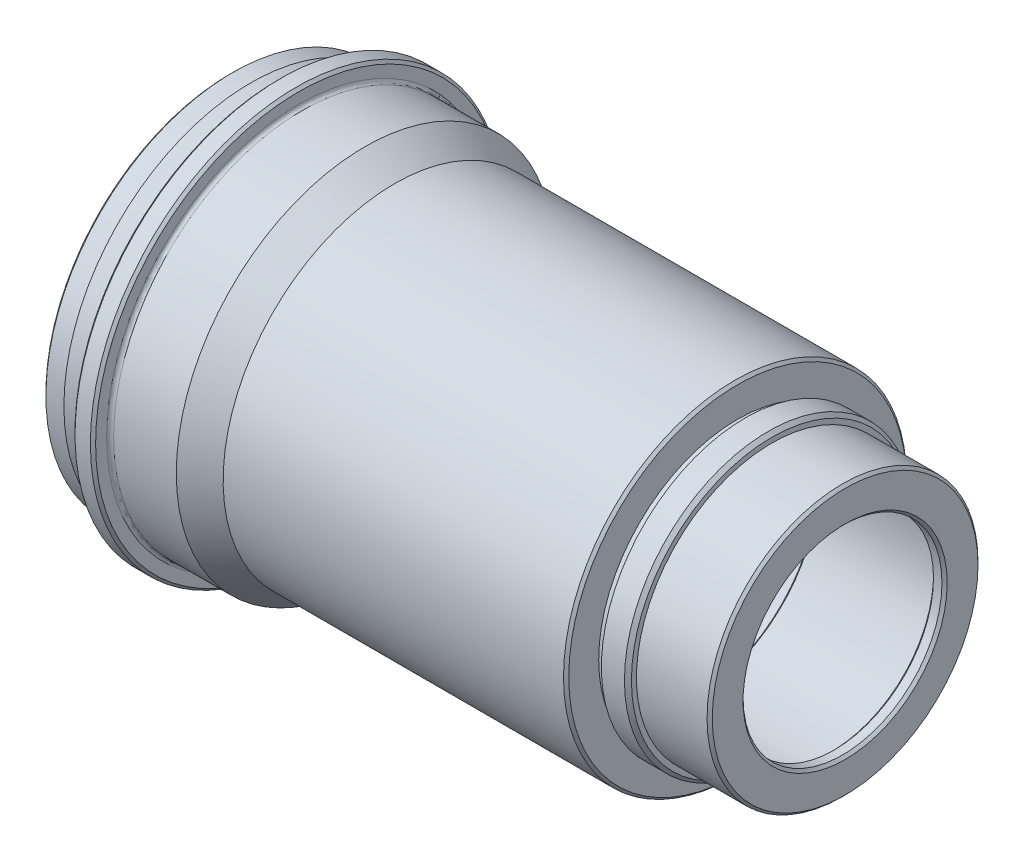
ISO-10303-21;
HEADER;
FILE_DESCRIPTION(('STEP AP214'),'2;1');
FILE_NAME('part.step','',(''),(''),'','','');
FILE_SCHEMA(('AUTOMOTIVE_DESIGN { 1 0 10303 214 1 1 1 1 }'));
ENDSEC;
DATA;
#1=APPLICATION_CONTEXT('core data for automotive mechanical design processes');
#2=APPLICATION_PROTOCOL_DEFINITION('international standard','automotive_design',2000,#1);
#3=PRODUCT_CONTEXT('',#1,'mechanical');
#4=PRODUCT('Part','Part','',(#3));
#5=PRODUCT_RELATED_PRODUCT_CATEGORY('part','',(#4));
#6=PRODUCT_DEFINITION_FORMATION('','',#4);
#7=PRODUCT_DEFINITION_CONTEXT('part definition',#1,'design');
#8=PRODUCT_DEFINITION('design','',#6,#7);
#9=PRODUCT_DEFINITION_SHAPE('','',#8);
#10=(LENGTH_UNIT() NAMED_UNIT(*) SI_UNIT(.MILLI.,.METRE.));
#11=(NAMED_UNIT(*) PLANE_ANGLE_UNIT() SI_UNIT($,.RADIAN.));
#12=(NAMED_UNIT(*) SI_UNIT($,.STERADIAN.) SOLID_ANGLE_UNIT());
#13=UNCERTAINTY_MEASURE_WITH_UNIT(LENGTH_MEASURE(1.E-05),#10,'distance_accuracy_value','');
#14=(GEOMETRIC_REPRESENTATION_CONTEXT(3) GLOBAL_UNCERTAINTY_ASSIGNED_CONTEXT((#13)) GLOBAL_UNIT_ASSIGNED_CONTEXT((#10,
#11,#12)) REPRESENTATION_CONTEXT('',''));
#15=CARTESIAN_POINT('',(0.,0.,0.));
#16=DIRECTION('',(0.,0.,1.));
#17=DIRECTION('',(1.,0.,0.));
#18=AXIS2_PLACEMENT_3D('',#15,#16,#17);
#19=CARTESIAN_POINT('',(72.0904430000001,0.,0.));
#20=DIRECTION('',(-1.,0.,0.));
#21=DIRECTION('',(0.,0.,1.));
#22=AXIS2_PLACEMENT_3D('',#19,#20,#21);
#23=CONICAL_SURFACE('',#22,25.,0.785398163397444);
#24=CARTESIAN_POINT('',(72.0904430000001,0.,0.));
#25=DIRECTION('',(1.,0.,0.));
#26=DIRECTION('',(0.,0.,-1.));
#27=AXIS2_PLACEMENT_3D('',#24,#25,#26);
#28=CIRCLE('',#27,25.);
#29=CARTESIAN_POINT('',(72.0904430000001,0.,-25.));
#30=VERTEX_POINT('',#29);
#31=EDGE_CURVE('E153',#30,#30,#28,.F.);
#32=ORIENTED_EDGE('',*,*,#31,.F.);
#33=EDGE_LOOP('',(#32));
#34=FACE_BOUND('',#33,.T.);
#35=CARTESIAN_POINT('',(72.4714430000001,0.,0.));
#36=DIRECTION('',(-1.,0.,0.));
#37=DIRECTION('',(0.,0.,1.));
#38=AXIS2_PLACEMENT_3D('',#35,#36,#37);
#39=CIRCLE('',#38,24.619);
#40=CARTESIAN_POINT('',(72.4714430000001,0.,24.619));
#41=VERTEX_POINT('',#40);
#42=EDGE_CURVE('E18',#41,#41,#39,.F.);
#43=ORIENTED_EDGE('',*,*,#42,.F.);
#44=EDGE_LOOP('',(#43));
#45=FACE_BOUND('',#44,.T.);
#46=ADVANCED_FACE('F15',(#34,#45),#23,.T.);
#47=CARTESIAN_POINT('',(47.4714430000001,0.,0.));
#48=DIRECTION('',(1.,0.,0.));
#49=DIRECTION('',(0.,0.,-1.));
#50=AXIS2_PLACEMENT_3D('',#47,#48,#49);
#51=CYLINDRICAL_SURFACE('',#50,25.);
#52=CARTESIAN_POINT('',(22.4714430000001,0.,0.));
#53=DIRECTION('',(-1.,0.,0.));
#54=DIRECTION('',(0.,1.,0.));
#55=AXIS2_PLACEMENT_3D('',#52,#53,#54);
#56=CIRCLE('',#55,25.);
#57=CARTESIAN_POINT('',(22.4714430000001,25.,0.));
#58=VERTEX_POINT('',#57);
#59=EDGE_CURVE('E158',#58,#58,#56,.T.);
#60=ORIENTED_EDGE('',*,*,#59,.F.);
#61=EDGE_LOOP('',(#60));
#62=FACE_BOUND('',#61,.T.);
#63=ORIENTED_EDGE('',*,*,#31,.T.);
#64=EDGE_LOOP('',(#63));
#65=FACE_BOUND('',#64,.T.);
#66=ADVANCED_FACE('F219',(#62,#65),#51,.T.);
#67=CARTESIAN_POINT('',(72.4714430000001,20.25,0.));
#68=DIRECTION('',(1.,0.,0.));
#69=DIRECTION('',(0.,0.,-1.));
#70=AXIS2_PLACEMENT_3D('',#67,#68,#69);
#71=PLANE('',#70);
#72=CARTESIAN_POINT('',(72.4714430000001,0.,0.));
#73=DIRECTION('',(1.,0.,0.));
#74=DIRECTION('',(0.,0.,-1.));
#75=AXIS2_PLACEMENT_3D('',#72,#73,#74);
#76=CIRCLE('',#75,20.25);
#77=CARTESIAN_POINT('',(72.4714430000001,0.,-20.25));
#78=VERTEX_POINT('',#77);
#79=EDGE_CURVE('E152',#78,#78,#76,.T.);
#80=ORIENTED_EDGE('',*,*,#79,.F.);
#81=EDGE_LOOP('',(#80));
#82=FACE_BOUND('',#81,.T.);
#83=ORIENTED_EDGE('',*,*,#42,.T.);
#84=EDGE_LOOP('',(#83));
#85=FACE_BOUND('',#84,.T.);
#86=ADVANCED_FACE('F215',(#82,#85),#71,.T.);
#87=CARTESIAN_POINT('',(18.1413159810779,0.,0.));
#88=DIRECTION('',(-1.,0.,0.));
#89=DIRECTION('',(0.,0.,1.));
#90=AXIS2_PLACEMENT_3D('',#87,#88,#89);
#91=CONICAL_SURFACE('',#90,27.5,0.523598775598295);
#92=CARTESIAN_POINT('',(18.1413159810779,0.,0.));
#93=DIRECTION('',(1.,0.,0.));
#94=DIRECTION('',(0.,0.,-1.));
#95=AXIS2_PLACEMENT_3D('',#92,#93,#94);
#96=CIRCLE('',#95,27.5);
#97=CARTESIAN_POINT('',(18.1413159810779,0.,-27.5));
#98=VERTEX_POINT('',#97);
#99=EDGE_CURVE('E144',#98,#98,#96,.F.);
#100=ORIENTED_EDGE('',*,*,#99,.F.);
#101=EDGE_LOOP('',(#100));
#102=FACE_BOUND('',#101,.T.);
#103=ORIENTED_EDGE('',*,*,#59,.T.);
#104=EDGE_LOOP('',(#103));
#105=FACE_BOUND('',#104,.T.);
#106=ADVANCED_FACE('F218',(#102,#105),#91,.T.);
#107=CARTESIAN_POINT('',(73.0339430000001,0.,0.));
#108=DIRECTION('',(1.,0.,0.));
#109=DIRECTION('',(0.,0.,-1.));
#110=AXIS2_PLACEMENT_3D('',#107,#108,#109);
#111=CYLINDRICAL_SURFACE('',#110,20.25);
#112=ORIENTED_EDGE('',*,*,#79,.T.);
#113=EDGE_LOOP('',(#112));
#114=FACE_BOUND('',#113,.T.);
#115=CARTESIAN_POINT('',(73.5964430000001,0.,0.));
#116=DIRECTION('',(1.,0.,0.));
#117=DIRECTION('',(0.,0.,-1.));
#118=AXIS2_PLACEMENT_3D('',#115,#116,#117);
#119=CIRCLE('',#118,20.25);
#120=CARTESIAN_POINT('',(73.5964430000001,0.,-20.25));
#121=VERTEX_POINT('',#120);
#122=EDGE_CURVE('E139',#121,#121,#119,.T.);
#123=ORIENTED_EDGE('',*,*,#122,.F.);
#124=EDGE_LOOP('',(#123));
#125=FACE_BOUND('',#124,.T.);
#126=ADVANCED_FACE('F212',(#114,#125),#111,.T.);
#127=CARTESIAN_POINT('',(13.320657990539,0.,0.));
#128=DIRECTION('',(1.,0.,0.));
#129=DIRECTION('',(0.,0.,-1.));
#130=AXIS2_PLACEMENT_3D('',#127,#128,#129);
#131=CYLINDRICAL_SURFACE('',#130,27.5);
#132=CARTESIAN_POINT('',(9.00799999999998,0.,0.));
#133=DIRECTION('',(1.,0.,0.));
#134=DIRECTION('',(0.,0.,-1.));
#135=AXIS2_PLACEMENT_3D('',#132,#133,#134);
#136=CIRCLE('',#135,27.5);
#137=CARTESIAN_POINT('',(9.00799999999998,0.,-27.5));
#138=VERTEX_POINT('',#137);
#139=EDGE_CURVE('E135',#138,#138,#136,.T.);
#140=ORIENTED_EDGE('',*,*,#139,.T.);
#141=EDGE_LOOP('',(#140));
#142=FACE_BOUND('',#141,.T.);
#143=ORIENTED_EDGE('',*,*,#99,.T.);
#144=EDGE_LOOP('',(#143));
#145=FACE_BOUND('',#144,.T.);
#146=ADVANCED_FACE('F385',(#142,#145),#131,.T.);
#147=CARTESIAN_POINT('',(73.5964430000001,20.989,0.));
#148=DIRECTION('',(-1.,0.,0.));
#149=DIRECTION('',(0.,0.,1.));
#150=AXIS2_PLACEMENT_3D('',#147,#148,#149);
#151=PLANE('',#150);
#152=ORIENTED_EDGE('',*,*,#122,.T.);
#153=EDGE_LOOP('',(#152));
#154=FACE_BOUND('',#153,.T.);
#155=CARTESIAN_POINT('',(73.5964430000001,0.,0.));
#156=DIRECTION('',(1.,0.,0.));
#157=DIRECTION('',(0.,0.,-1.));
#158=AXIS2_PLACEMENT_3D('',#155,#156,#157);
#159=CIRCLE('',#158,20.989);
#160=CARTESIAN_POINT('',(73.5964430000001,0.,-20.989));
#161=VERTEX_POINT('',#160);
#162=EDGE_CURVE('E138',#161,#161,#159,.T.);
#163=ORIENTED_EDGE('',*,*,#162,.F.);
#164=EDGE_LOOP('',(#163));
#165=FACE_BOUND('',#164,.T.);
#166=ADVANCED_FACE('F129',(#154,#165),#151,.T.);
#167=CARTESIAN_POINT('',(9.00799999999998,0.,0.));
#168=DIRECTION('',(1.,0.,0.));
#169=DIRECTION('',(0.,0.,-1.));
#170=AXIS2_PLACEMENT_3D('',#167,#168,#169);
#171=TOROIDAL_SURFACE('',#170,28.008,0.508);
#172=ORIENTED_EDGE('',*,*,#139,.F.);
#173=EDGE_LOOP('',(#172));
#174=FACE_BOUND('',#173,.T.);
#175=CARTESIAN_POINT('',(8.49999999999998,0.,0.));
#176=DIRECTION('',(1.,0.,0.));
#177=DIRECTION('',(0.,0.,1.));
#178=AXIS2_PLACEMENT_3D('',#175,#176,#177);
#179=CIRCLE('',#178,28.008);
#180=CARTESIAN_POINT('',(8.49999999999998,0.,28.008));
#181=VERTEX_POINT('',#180);
#182=EDGE_CURVE('E102',#181,#181,#179,.F.);
#183=ORIENTED_EDGE('',*,*,#182,.F.);
#184=EDGE_LOOP('',(#183));
#185=FACE_BOUND('',#184,.T.);
#186=ADVANCED_FACE('F124',(#174,#185),#171,.F.);
#187=CARTESIAN_POINT('',(75.5339430000001,0.,0.));
#188=DIRECTION('',(1.,0.,0.));
#189=DIRECTION('',(0.,0.,-1.));
#190=AXIS2_PLACEMENT_3D('',#187,#188,#189);
#191=CYLINDRICAL_SURFACE('',#190,20.989);
#192=ORIENTED_EDGE('',*,*,#162,.T.);
#193=EDGE_LOOP('',(#192));
#194=FACE_BOUND('',#193,.T.);
#195=CARTESIAN_POINT('',(76.9634430000002,0.,0.));
#196=DIRECTION('',(-1.,0.,0.));
#197=DIRECTION('',(0.,-1.,0.));
#198=AXIS2_PLACEMENT_3D('',#195,#196,#197);
#199=CIRCLE('',#198,20.989);
#200=CARTESIAN_POINT('',(76.9634430000002,-20.989,0.));
#201=VERTEX_POINT('',#200);
#202=EDGE_CURVE('E107',#201,#201,#199,.F.);
#203=ORIENTED_EDGE('',*,*,#202,.F.);
#204=EDGE_LOOP('',(#203));
#205=FACE_BOUND('',#204,.T.);
#206=ADVANCED_FACE('F120',(#194,#205),#191,.T.);
#207=CARTESIAN_POINT('',(8.49999999999998,27.5,0.));
#208=DIRECTION('',(1.,0.,0.));
#209=DIRECTION('',(0.,0.,-1.));
#210=AXIS2_PLACEMENT_3D('',#207,#208,#209);
#211=PLANE('',#210);
#212=ORIENTED_EDGE('',*,*,#182,.T.);
#213=EDGE_LOOP('',(#212));
#214=FACE_BOUND('',#213,.T.);
#215=CARTESIAN_POINT('',(8.49999999999998,0.,0.));
#216=DIRECTION('',(-1.,0.,0.));
#217=DIRECTION('',(0.,0.,1.));
#218=AXIS2_PLACEMENT_3D('',#215,#216,#217);
#219=CIRCLE('',#218,29.619);
#220=CARTESIAN_POINT('',(8.49999999999998,0.,29.619));
#221=VERTEX_POINT('',#220);
#222=EDGE_CURVE('E203',#221,#221,#219,.T.);
#223=ORIENTED_EDGE('',*,*,#222,.F.);
#224=EDGE_LOOP('',(#223));
#225=FACE_BOUND('',#224,.T.);
#226=ADVANCED_FACE('F109',(#214,#225),#211,.T.);
#227=CARTESIAN_POINT('',(76.9634430000002,0.,0.));
#228=DIRECTION('',(-1.,0.,0.));
#229=DIRECTION('',(0.,0.,1.));
#230=AXIS2_PLACEMENT_3D('',#227,#228,#229);
#231=CONICAL_SURFACE('',#230,20.989,0.785398163397455);
#232=ORIENTED_EDGE('',*,*,#202,.T.);
#233=EDGE_LOOP('',(#232));
#234=FACE_BOUND('',#233,.T.);
#235=CARTESIAN_POINT('',(77.4714430000001,0.,0.));
#236=DIRECTION('',(-1.,0.,0.));
#237=DIRECTION('',(0.,0.,1.));
#238=AXIS2_PLACEMENT_3D('',#235,#236,#237);
#239=CIRCLE('',#238,20.481);
#240=CARTESIAN_POINT('',(77.4714430000001,0.,20.481));
#241=VERTEX_POINT('',#240);
#242=EDGE_CURVE('E93',#241,#241,#239,.F.);
#243=ORIENTED_EDGE('',*,*,#242,.F.);
#244=EDGE_LOOP('',(#243));
#245=FACE_BOUND('',#244,.T.);
#246=ADVANCED_FACE('F119',(#234,#245),#231,.T.);
#247=CARTESIAN_POINT('',(8.11899999999998,0.,0.));
#248=DIRECTION('',(-1.,0.,0.));
#249=DIRECTION('',(0.,0.,1.));
#250=AXIS2_PLACEMENT_3D('',#247,#248,#249);
#251=CONICAL_SURFACE('',#250,30.,0.785398163397435);
#252=CARTESIAN_POINT('',(8.11899999999998,0.,0.));
#253=DIRECTION('',(1.,0.,0.));
#254=DIRECTION('',(0.,0.,-1.));
#255=AXIS2_PLACEMENT_3D('',#252,#253,#254);
#256=CIRCLE('',#255,30.);
#257=CARTESIAN_POINT('',(8.11899999999998,0.,-30.));
#258=VERTEX_POINT('',#257);
#259=EDGE_CURVE('E89',#258,#258,#256,.F.);
#260=ORIENTED_EDGE('',*,*,#259,.F.);
#261=EDGE_LOOP('',(#260));
#262=FACE_BOUND('',#261,.T.);
#263=ORIENTED_EDGE('',*,*,#222,.T.);
#264=EDGE_LOOP('',(#263));
#265=FACE_BOUND('',#264,.T.);
#266=ADVANCED_FACE('F344',(#262,#265),#251,.T.);
#267=CARTESIAN_POINT('',(77.4714430000001,19.75,0.));
#268=DIRECTION('',(1.,0.,0.));
#269=DIRECTION('',(0.,0.,-1.));
#270=AXIS2_PLACEMENT_3D('',#267,#268,#269);
#271=PLANE('',#270);
#272=CARTESIAN_POINT('',(77.4714430000001,0.,0.));
#273=DIRECTION('',(1.,0.,0.));
#274=DIRECTION('',(0.,0.,-1.));
#275=AXIS2_PLACEMENT_3D('',#272,#273,#274);
#276=CIRCLE('',#275,19.75);
#277=CARTESIAN_POINT('',(77.4714430000001,0.,-19.75));
#278=VERTEX_POINT('',#277);
#279=EDGE_CURVE('E92',#278,#278,#276,.T.);
#280=ORIENTED_EDGE('',*,*,#279,.F.);
#281=EDGE_LOOP('',(#280));
#282=FACE_BOUND('',#281,.T.);
#283=ORIENTED_EDGE('',*,*,#242,.T.);
#284=EDGE_LOOP('',(#283));
#285=FACE_BOUND('',#284,.T.);
#286=ADVANCED_FACE('F341',(#282,#285),#271,.T.);
#287=CARTESIAN_POINT('',(6.99999999999998,0.,0.));
#288=DIRECTION('',(1.,0.,0.));
#289=DIRECTION('',(0.,0.,-1.));
#290=AXIS2_PLACEMENT_3D('',#287,#288,#289);
#291=CYLINDRICAL_SURFACE('',#290,30.);
#292=CARTESIAN_POINT('',(5.88099999999998,0.,0.));
#293=DIRECTION('',(1.,0.,0.));
#294=DIRECTION('',(0.,-1.,0.));
#295=AXIS2_PLACEMENT_3D('',#292,#293,#294);
#296=CIRCLE('',#295,30.);
#297=CARTESIAN_POINT('',(5.88099999999998,-30.,0.));
#298=VERTEX_POINT('',#297);
#299=EDGE_CURVE('E88',#298,#298,#296,.F.);
#300=ORIENTED_EDGE('',*,*,#299,.F.);
#301=EDGE_LOOP('',(#300));
#302=FACE_BOUND('',#301,.T.);
#303=ORIENTED_EDGE('',*,*,#259,.T.);
#304=EDGE_LOOP('',(#303));
#305=FACE_BOUND('',#304,.T.);
#306=ADVANCED_FACE('F337',(#302,#305),#291,.T.);
#307=CARTESIAN_POINT('',(82.8084294961618,0.,0.));
#308=DIRECTION('',(1.,0.,0.));
#309=DIRECTION('',(0.,0.,-1.));
#310=AXIS2_PLACEMENT_3D('',#307,#308,#309);
#311=CYLINDRICAL_SURFACE('',#310,19.75);
#312=ORIENTED_EDGE('',*,*,#279,.T.);
#313=EDGE_LOOP('',(#312));
#314=FACE_BOUND('',#313,.T.);
#315=CARTESIAN_POINT('',(87.7644159923235,0.,0.));
#316=DIRECTION('',(-1.,0.,0.));
#317=DIRECTION('',(0.,-1.,0.));
#318=AXIS2_PLACEMENT_3D('',#315,#316,#317);
#319=CIRCLE('',#318,19.75);
#320=CARTESIAN_POINT('',(87.7644159923235,-19.75,0.));
#321=VERTEX_POINT('',#320);
#322=EDGE_CURVE('E84',#321,#321,#319,.F.);
#323=ORIENTED_EDGE('',*,*,#322,.F.);
#324=EDGE_LOOP('',(#323));
#325=FACE_BOUND('',#324,.T.);
#326=ADVANCED_FACE('F333',(#314,#325),#311,.T.);
#327=CARTESIAN_POINT('',(5.88099999999998,0.,0.));
#328=DIRECTION('',(1.,0.,0.));
#329=DIRECTION('',(0.,0.,-1.));
#330=AXIS2_PLACEMENT_3D('',#327,#328,#329);
#331=CONICAL_SURFACE('',#330,30.,0.785398163397448);
#332=CARTESIAN_POINT('',(5.49999999999998,0.,0.));
#333=DIRECTION('',(1.,0.,0.));
#334=DIRECTION('',(0.,0.,-1.));
#335=AXIS2_PLACEMENT_3D('',#332,#333,#334);
#336=CIRCLE('',#335,29.619);
#337=CARTESIAN_POINT('',(5.49999999999998,0.,-29.619));
#338=VERTEX_POINT('',#337);
#339=EDGE_CURVE('E87',#338,#338,#336,.F.);
#340=ORIENTED_EDGE('',*,*,#339,.F.);
#341=EDGE_LOOP('',(#340));
#342=FACE_BOUND('',#341,.T.);
#343=ORIENTED_EDGE('',*,*,#299,.T.);
#344=EDGE_LOOP('',(#343));
#345=FACE_BOUND('',#344,.T.);
#346=ADVANCED_FACE('F329',(#342,#345),#331,.T.);
#347=CARTESIAN_POINT('',(87.7644159923235,0.,0.));
#348=DIRECTION('',(-1.,0.,0.));
#349=DIRECTION('',(0.,0.,1.));
#350=AXIS2_PLACEMENT_3D('',#347,#348,#349);
#351=CONICAL_SURFACE('',#350,19.75,0.785398163397448);
#352=ORIENTED_EDGE('',*,*,#322,.T.);
#353=EDGE_LOOP('',(#352));
#354=FACE_BOUND('',#353,.T.);
#355=CARTESIAN_POINT('',(88.1454159923235,0.,0.));
#356=DIRECTION('',(-1.,0.,0.));
#357=DIRECTION('',(0.,0.,1.));
#358=AXIS2_PLACEMENT_3D('',#355,#356,#357);
#359=CIRCLE('',#358,19.369);
#360=CARTESIAN_POINT('',(88.1454159923235,0.,19.369));
#361=VERTEX_POINT('',#360);
#362=EDGE_CURVE('E194',#361,#361,#359,.F.);
#363=ORIENTED_EDGE('',*,*,#362,.F.);
#364=EDGE_LOOP('',(#363));
#365=FACE_BOUND('',#364,.T.);
#366=ADVANCED_FACE('F325',(#354,#365),#351,.T.);
#367=CARTESIAN_POINT('',(5.49999999999998,30.,0.));
#368=DIRECTION('',(-1.,0.,0.));
#369=DIRECTION('',(0.,0.,1.));
#370=AXIS2_PLACEMENT_3D('',#367,#368,#369);
#371=PLANE('',#370);
#372=CARTESIAN_POINT('',(5.49999999999999,0.,0.));
#373=DIRECTION('',(-1.,0.,0.));
#374=DIRECTION('',(0.,0.,1.));
#375=AXIS2_PLACEMENT_3D('',#372,#373,#374);
#376=CIRCLE('',#375,26.1697032302756);
#377=CARTESIAN_POINT('',(5.49999999999999,0.,26.1697032302756));
#378=VERTEX_POINT('',#377);
#379=EDGE_CURVE('E191',#378,#378,#376,.T.);
#380=ORIENTED_EDGE('',*,*,#379,.F.);
#381=EDGE_LOOP('',(#380));
#382=FACE_BOUND('',#381,.T.);
#383=ORIENTED_EDGE('',*,*,#339,.T.);
#384=EDGE_LOOP('',(#383));
#385=FACE_BOUND('',#384,.T.);
#386=ADVANCED_FACE('F321',(#382,#385),#371,.T.);
#387=CARTESIAN_POINT('',(88.1454159923235,14.5,0.));
#388=DIRECTION('',(1.,0.,0.));
#389=DIRECTION('',(0.,0.,-1.));
#390=AXIS2_PLACEMENT_3D('',#387,#388,#389);
#391=PLANE('',#390);
#392=CARTESIAN_POINT('',(88.1454159923235,0.,0.));
#393=DIRECTION('',(1.,0.,0.));
#394=DIRECTION('',(0.,0.,-1.));
#395=AXIS2_PLACEMENT_3D('',#392,#393,#394);
#396=CIRCLE('',#395,14.881);
#397=CARTESIAN_POINT('',(88.1454159923235,0.,-14.881));
#398=VERTEX_POINT('',#397);
#399=EDGE_CURVE('E81',#398,#398,#396,.F.);
#400=ORIENTED_EDGE('',*,*,#399,.T.);
#401=EDGE_LOOP('',(#400));
#402=FACE_BOUND('',#401,.T.);
#403=ORIENTED_EDGE('',*,*,#362,.T.);
#404=EDGE_LOOP('',(#403));
#405=FACE_BOUND('',#404,.T.);
#406=ADVANCED_FACE('F317',(#402,#405),#391,.T.);
#407=CARTESIAN_POINT('',(1.49999999999999,0.,0.));
#408=DIRECTION('',(-1.,0.,0.));
#409=DIRECTION('',(0.,0.,1.));
#410=AXIS2_PLACEMENT_3D('',#407,#408,#409);
#411=CONICAL_SURFACE('',#410,27.2415,0.261799387799148);
#412=CARTESIAN_POINT('',(1.49999999999998,0.,0.));
#413=DIRECTION('',(1.,0.,0.));
#414=DIRECTION('',(0.,0.,-1.));
#415=AXIS2_PLACEMENT_3D('',#412,#413,#414);
#416=CIRCLE('',#415,27.2415);
#417=CARTESIAN_POINT('',(1.49999999999998,0.,-27.2415));
#418=VERTEX_POINT('',#417);
#419=EDGE_CURVE('E72',#418,#418,#416,.F.);
#420=ORIENTED_EDGE('',*,*,#419,.F.);
#421=EDGE_LOOP('',(#420));
#422=FACE_BOUND('',#421,.T.);
#423=ORIENTED_EDGE('',*,*,#379,.T.);
#424=EDGE_LOOP('',(#423));
#425=FACE_BOUND('',#424,.T.);
#426=ADVANCED_FACE('F313',(#422,#425),#411,.T.);
#427=CARTESIAN_POINT('',(88.1454159923235,0.,0.));
#428=DIRECTION('',(1.,0.,0.));
#429=DIRECTION('',(0.,0.,-1.));
#430=AXIS2_PLACEMENT_3D('',#427,#428,#429);
#431=CONICAL_SURFACE('',#430,14.881,0.785398163397451);
#432=ORIENTED_EDGE('',*,*,#399,.F.);
#433=EDGE_LOOP('',(#432));
#434=FACE_BOUND('',#433,.T.);
#435=CARTESIAN_POINT('',(87.7644159923235,0.,0.));
#436=DIRECTION('',(1.,0.,0.));
#437=DIRECTION('',(0.,0.,-1.));
#438=AXIS2_PLACEMENT_3D('',#435,#436,#437);
#439=CIRCLE('',#438,14.5);
#440=CARTESIAN_POINT('',(87.7644159923235,0.,-14.5));
#441=VERTEX_POINT('',#440);
#442=EDGE_CURVE('E68',#441,#441,#439,.F.);
#443=ORIENTED_EDGE('',*,*,#442,.T.);
#444=EDGE_LOOP('',(#443));
#445=FACE_BOUND('',#444,.T.);
#446=ADVANCED_FACE('F309',(#434,#445),#431,.F.);
#447=CARTESIAN_POINT('',(0.,0.,0.));
#448=DIRECTION('',(1.,0.,0.));
#449=DIRECTION('',(0.,0.,-1.));
#450=AXIS2_PLACEMENT_3D('',#447,#448,#449);
#451=CYLINDRICAL_SURFACE('',#450,27.2415);
#452=CARTESIAN_POINT('',(-1.11900000000002,0.,0.));
#453=DIRECTION('',(1.,0.,0.));
#454=DIRECTION('',(0.,-1.,0.));
#455=AXIS2_PLACEMENT_3D('',#452,#453,#454);
#456=CIRCLE('',#455,27.2415);
#457=CARTESIAN_POINT('',(-1.11900000000002,-27.2415,0.));
#458=VERTEX_POINT('',#457);
#459=EDGE_CURVE('E71',#458,#458,#456,.F.);
#460=ORIENTED_EDGE('',*,*,#459,.F.);
#461=EDGE_LOOP('',(#460));
#462=FACE_BOUND('',#461,.T.);
#463=ORIENTED_EDGE('',*,*,#419,.T.);
#464=EDGE_LOOP('',(#463));
#465=FACE_BOUND('',#464,.T.);
#466=ADVANCED_FACE('F305',(#462,#465),#451,.T.);
#467=CARTESIAN_POINT('',(87.1454159923235,0.,0.));
#468=DIRECTION('',(1.,0.,0.));
#469=DIRECTION('',(0.,0.,-1.));
#470=AXIS2_PLACEMENT_3D('',#467,#468,#469);
#471=CYLINDRICAL_SURFACE('',#470,14.5);
#472=CARTESIAN_POINT('',(86.5264159923235,0.,0.));
#473=DIRECTION('',(-1.,0.,0.));
#474=DIRECTION('',(0.,-1.,0.));
#475=AXIS2_PLACEMENT_3D('',#472,#473,#474);
#476=CIRCLE('',#475,14.5);
#477=CARTESIAN_POINT('',(86.5264159923235,-14.5,0.));
#478=VERTEX_POINT('',#477);
#479=EDGE_CURVE('E75',#478,#478,#476,.T.);
#480=ORIENTED_EDGE('',*,*,#479,.T.);
#481=EDGE_LOOP('',(#480));
#482=FACE_BOUND('',#481,.T.);
#483=ORIENTED_EDGE('',*,*,#442,.F.);
#484=EDGE_LOOP('',(#483));
#485=FACE_BOUND('',#484,.T.);
#486=ADVANCED_FACE('F301',(#482,#485),#471,.F.);
#487=CARTESIAN_POINT('',(-1.11900000000002,0.,0.));
#488=DIRECTION('',(1.,0.,0.));
#489=DIRECTION('',(0.,0.,-1.));
#490=AXIS2_PLACEMENT_3D('',#487,#488,#489);
#491=CONICAL_SURFACE('',#490,27.2415,0.785398163397449);
#492=CARTESIAN_POINT('',(-1.50000000000002,0.,0.));
#493=DIRECTION('',(1.,0.,0.));
#494=DIRECTION('',(0.,0.,-1.));
#495=AXIS2_PLACEMENT_3D('',#492,#493,#494);
#496=CIRCLE('',#495,26.8605);
#497=CARTESIAN_POINT('',(-1.50000000000002,0.,-26.8605));
#498=VERTEX_POINT('',#497);
#499=EDGE_CURVE('E78',#498,#498,#496,.F.);
#500=ORIENTED_EDGE('',*,*,#499,.F.);
#501=EDGE_LOOP('',(#500));
#502=FACE_BOUND('',#501,.T.);
#503=ORIENTED_EDGE('',*,*,#459,.T.);
#504=EDGE_LOOP('',(#503));
#505=FACE_BOUND('',#504,.T.);
#506=ADVANCED_FACE('F297',(#502,#505),#491,.T.);
#507=CARTESIAN_POINT('',(86.1454159923235,0.,0.));
#508=DIRECTION('',(-1.,0.,0.));
#509=DIRECTION('',(0.,0.,1.));
#510=AXIS2_PLACEMENT_3D('',#507,#508,#509);
#511=CONICAL_SURFACE('',#510,14.881,0.785398163397448);
#512=ORIENTED_EDGE('',*,*,#479,.F.);
#513=EDGE_LOOP('',(#512));
#514=FACE_BOUND('',#513,.T.);
#515=CARTESIAN_POINT('',(86.1454159923235,0.,0.));
#516=DIRECTION('',(-1.,0.,0.));
#517=DIRECTION('',(0.,0.,1.));
#518=AXIS2_PLACEMENT_3D('',#515,#516,#517);
#519=CIRCLE('',#518,14.881);
#520=CARTESIAN_POINT('',(86.1454159923235,0.,14.881));
#521=VERTEX_POINT('',#520);
#522=EDGE_CURVE('E184',#521,#521,#519,.F.);
#523=ORIENTED_EDGE('',*,*,#522,.F.);
#524=EDGE_LOOP('',(#523));
#525=FACE_BOUND('',#524,.T.);
#526=ADVANCED_FACE('F293',(#514,#525),#511,.F.);
#527=CARTESIAN_POINT('',(-1.50000000000002,27.2415,0.));
#528=DIRECTION('',(-1.,0.,0.));
#529=DIRECTION('',(0.,0.,1.));
#530=AXIS2_PLACEMENT_3D('',#527,#528,#529);
#531=PLANE('',#530);
#532=CARTESIAN_POINT('',(-1.50000000000002,0.,0.));
#533=DIRECTION('',(-1.,0.,0.));
#534=DIRECTION('',(0.,0.,1.));
#535=AXIS2_PLACEMENT_3D('',#532,#533,#534);
#536=CIRCLE('',#535,25.2375);
#537=CARTESIAN_POINT('',(-1.50000000000002,0.,25.2375));
#538=VERTEX_POINT('',#537);
#539=EDGE_CURVE('E181',#538,#538,#536,.F.);
#540=ORIENTED_EDGE('',*,*,#539,.T.);
#541=EDGE_LOOP('',(#540));
#542=FACE_BOUND('',#541,.T.);
#543=ORIENTED_EDGE('',*,*,#499,.T.);
#544=EDGE_LOOP('',(#543));
#545=FACE_BOUND('',#544,.T.);
#546=ADVANCED_FACE('F289',(#542,#545),#531,.T.);
#547=CARTESIAN_POINT('',(86.1454159923235,18.415,0.));
#548=DIRECTION('',(-1.,0.,0.));
#549=DIRECTION('',(0.,0.,1.));
#550=AXIS2_PLACEMENT_3D('',#547,#548,#549);
#551=PLANE('',#550);
#552=ORIENTED_EDGE('',*,*,#522,.T.);
#553=EDGE_LOOP('',(#552));
#554=FACE_BOUND('',#553,.T.);
#555=CARTESIAN_POINT('',(86.1454159923235,0.,0.));
#556=DIRECTION('',(1.,0.,0.));
#557=DIRECTION('',(0.,0.,-1.));
#558=AXIS2_PLACEMENT_3D('',#555,#556,#557);
#559=CIRCLE('',#558,18.415);
#560=CARTESIAN_POINT('',(86.1454159923235,0.,-18.415));
#561=VERTEX_POINT('',#560);
#562=EDGE_CURVE('E65',#561,#561,#559,.F.);
#563=ORIENTED_EDGE('',*,*,#562,.T.);
#564=EDGE_LOOP('',(#563));
#565=FACE_BOUND('',#564,.T.);
#566=ADVANCED_FACE('F285',(#554,#565),#551,.T.);
#567=CARTESIAN_POINT('',(-1.50000000000002,0.,0.));
#568=DIRECTION('',(-1.,0.,0.));
#569=DIRECTION('',(0.,0.,1.));
#570=AXIS2_PLACEMENT_3D('',#567,#568,#569);
#571=CONICAL_SURFACE('',#570,25.2375,0.785398163397448);
#572=CARTESIAN_POINT('',(-0.992000000000019,0.,0.));
#573=DIRECTION('',(1.,0.,0.));
#574=DIRECTION('',(0.,0.,-1.));
#575=AXIS2_PLACEMENT_3D('',#572,#573,#574);
#576=CIRCLE('',#575,24.7295);
#577=CARTESIAN_POINT('',(-0.992000000000019,0.,-24.7295));
#578=VERTEX_POINT('',#577);
#579=EDGE_CURVE('E61',#578,#578,#576,.T.);
#580=ORIENTED_EDGE('',*,*,#579,.T.);
#581=EDGE_LOOP('',(#580));
#582=FACE_BOUND('',#581,.T.);
#583=ORIENTED_EDGE('',*,*,#539,.F.);
#584=EDGE_LOOP('',(#583));
#585=FACE_BOUND('',#584,.T.);
#586=ADVANCED_FACE('F281',(#582,#585),#571,.F.);
#587=CARTESIAN_POINT('',(85.1294159923235,0.,0.));
#588=DIRECTION('',(1.,0.,0.));
#589=DIRECTION('',(0.,0.,-1.));
#590=AXIS2_PLACEMENT_3D('',#587,#588,#589);
#591=CYLINDRICAL_SURFACE('',#590,18.415);
#592=CARTESIAN_POINT('',(84.1134159923235,0.,0.));
#593=DIRECTION('',(1.,0.,0.));
#594=DIRECTION('',(0.,0.,-1.));
#595=AXIS2_PLACEMENT_3D('',#592,#593,#594);
#596=CIRCLE('',#595,18.415);
#597=CARTESIAN_POINT('',(84.1134159923235,0.,-18.415));
#598=VERTEX_POINT('',#597);
#599=EDGE_CURVE('E64',#598,#598,#596,.T.);
#600=ORIENTED_EDGE('',*,*,#599,.F.);
#601=EDGE_LOOP('',(#600));
#602=FACE_BOUND('',#601,.T.);
#603=ORIENTED_EDGE('',*,*,#562,.F.);
#604=EDGE_LOOP('',(#603));
#605=FACE_BOUND('',#604,.T.);
#606=ADVANCED_FACE('F277',(#602,#605),#591,.F.);
#607=CARTESIAN_POINT('',(0.437499999999981,0.,0.));
#608=DIRECTION('',(1.,0.,0.));
#609=DIRECTION('',(0.,0.,-1.));
#610=AXIS2_PLACEMENT_3D('',#607,#608,#609);
#611=CYLINDRICAL_SURFACE('',#610,24.7295);
#612=ORIENTED_EDGE('',*,*,#579,.F.);
#613=EDGE_LOOP('',(#612));
#614=FACE_BOUND('',#613,.T.);
#615=CARTESIAN_POINT('',(2.37499999999998,0.,0.));
#616=DIRECTION('',(1.,0.,0.));
#617=DIRECTION('',(0.,0.,-1.));
#618=AXIS2_PLACEMENT_3D('',#615,#616,#617);
#619=CIRCLE('',#618,24.7295);
#620=CARTESIAN_POINT('',(2.37499999999998,0.,-24.7295));
#621=VERTEX_POINT('',#620);
#622=EDGE_CURVE('E174',#621,#621,#619,.F.);
#623=ORIENTED_EDGE('',*,*,#622,.F.);
#624=EDGE_LOOP('',(#623));
#625=FACE_BOUND('',#624,.T.);
#626=ADVANCED_FACE('F273',(#614,#625),#611,.F.);
#627=CARTESIAN_POINT('',(84.1134159923235,18.034,0.));
#628=DIRECTION('',(1.,0.,0.));
#629=DIRECTION('',(0.,0.,-1.));
#630=AXIS2_PLACEMENT_3D('',#627,#628,#629);
#631=PLANE('',#630);
#632=CARTESIAN_POINT('',(84.1134159923235,0.,0.));
#633=DIRECTION('',(1.,0.,0.));
#634=DIRECTION('',(0.,0.,-1.));
#635=AXIS2_PLACEMENT_3D('',#632,#633,#634);
#636=CIRCLE('',#635,18.034);
#637=CARTESIAN_POINT('',(84.1134159923235,0.,-18.034));
#638=VERTEX_POINT('',#637);
#639=EDGE_CURVE('E171',#638,#638,#636,.F.);
#640=ORIENTED_EDGE('',*,*,#639,.T.);
#641=EDGE_LOOP('',(#640));
#642=FACE_BOUND('',#641,.T.);
#643=ORIENTED_EDGE('',*,*,#599,.T.);
#644=EDGE_LOOP('',(#643));
#645=FACE_BOUND('',#644,.T.);
#646=ADVANCED_FACE('F269',(#642,#645),#631,.T.);
#647=CARTESIAN_POINT('',(2.37499999999998,24.7295,0.));
#648=DIRECTION('',(1.,0.,0.));
#649=DIRECTION('',(0.,0.,-1.));
#650=AXIS2_PLACEMENT_3D('',#647,#648,#649);
#651=PLANE('',#650);
#652=ORIENTED_EDGE('',*,*,#622,.T.);
#653=EDGE_LOOP('',(#652));
#654=FACE_BOUND('',#653,.T.);
#655=CARTESIAN_POINT('',(2.37499999999998,0.,0.));
#656=DIRECTION('',(1.,0.,0.));
#657=DIRECTION('',(0.,0.,-1.));
#658=AXIS2_PLACEMENT_3D('',#655,#656,#657);
#659=CIRCLE('',#658,25.125);
#660=CARTESIAN_POINT('',(2.37499999999998,0.,-25.125));
#661=VERTEX_POINT('',#660);
#662=EDGE_CURVE('E60',#661,#661,#659,.T.);
#663=ORIENTED_EDGE('',*,*,#662,.T.);
#664=EDGE_LOOP('',(#663));
#665=FACE_BOUND('',#664,.T.);
#666=ADVANCED_FACE('F262',(#654,#665),#651,.T.);
#667=CARTESIAN_POINT('',(74.9694159923235,0.,0.));
#668=DIRECTION('',(1.,0.,0.));
#669=DIRECTION('',(0.,0.,-1.));
#670=AXIS2_PLACEMENT_3D('',#667,#668,#669);
#671=CYLINDRICAL_SURFACE('',#670,18.034);
#672=CARTESIAN_POINT('',(66.2064159923235,0.,0.));
#673=DIRECTION('',(-1.,0.,0.));
#674=DIRECTION('',(0.,-1.,0.));
#675=AXIS2_PLACEMENT_3D('',#672,#673,#674);
#676=CIRCLE('',#675,18.034);
#677=CARTESIAN_POINT('',(66.2064159923235,-18.034,0.));
#678=VERTEX_POINT('',#677);
#679=EDGE_CURVE('E51',#678,#678,#676,.T.);
#680=ORIENTED_EDGE('',*,*,#679,.T.);
#681=EDGE_LOOP('',(#680));
#682=FACE_BOUND('',#681,.T.);
#683=ORIENTED_EDGE('',*,*,#639,.F.);
#684=EDGE_LOOP('',(#683));
#685=FACE_BOUND('',#684,.T.);
#686=ADVANCED_FACE('F253',(#682,#685),#671,.F.);
#687=CARTESIAN_POINT('',(2.93749999999998,0.,0.));
#688=DIRECTION('',(1.,0.,0.));
#689=DIRECTION('',(0.,0.,-1.));
#690=AXIS2_PLACEMENT_3D('',#687,#688,#689);
#691=CYLINDRICAL_SURFACE('',#690,25.125);
#692=ORIENTED_EDGE('',*,*,#662,.F.);
#693=EDGE_LOOP('',(#692));
#694=FACE_BOUND('',#693,.T.);
#695=CARTESIAN_POINT('',(3.49999999999998,0.,0.));
#696=DIRECTION('',(1.,0.,0.));
#697=DIRECTION('',(0.,0.,-1.));
#698=AXIS2_PLACEMENT_3D('',#695,#696,#697);
#699=CIRCLE('',#698,25.125);
#700=CARTESIAN_POINT('',(3.49999999999998,0.,-25.125));
#701=VERTEX_POINT('',#700);
#702=EDGE_CURVE('E59',#701,#701,#699,.F.);
#703=ORIENTED_EDGE('',*,*,#702,.F.);
#704=EDGE_LOOP('',(#703));
#705=FACE_BOUND('',#704,.T.);
#706=ADVANCED_FACE('F251',(#694,#705),#691,.F.);
#707=CARTESIAN_POINT('',(65.8254159923235,0.,0.));
#708=DIRECTION('',(-1.,0.,0.));
#709=DIRECTION('',(0.,0.,1.));
#710=AXIS2_PLACEMENT_3D('',#707,#708,#709);
#711=CONICAL_SURFACE('',#710,18.415,0.785398163397444);
#712=ORIENTED_EDGE('',*,*,#679,.F.);
#713=EDGE_LOOP('',(#712));
#714=FACE_BOUND('',#713,.T.);
#715=CARTESIAN_POINT('',(65.8254159923235,0.,0.));
#716=DIRECTION('',(-1.,0.,0.));
#717=DIRECTION('',(0.,0.,1.));
#718=AXIS2_PLACEMENT_3D('',#715,#716,#717);
#719=CIRCLE('',#718,18.415);
#720=CARTESIAN_POINT('',(65.8254159923235,0.,18.415));
#721=VERTEX_POINT('',#720);
#722=EDGE_CURVE('E164',#721,#721,#719,.F.);
#723=ORIENTED_EDGE('',*,*,#722,.F.);
#724=EDGE_LOOP('',(#723));
#725=FACE_BOUND('',#724,.T.);
#726=ADVANCED_FACE('F247',(#714,#725),#711,.F.);
#727=CARTESIAN_POINT('',(3.49999999999998,25.125,0.));
#728=DIRECTION('',(-1.,0.,0.));
#729=DIRECTION('',(0.,0.,1.));
#730=AXIS2_PLACEMENT_3D('',#727,#728,#729);
#731=PLANE('',#730);
#732=CARTESIAN_POINT('',(3.49999999999998,0.,0.));
#733=DIRECTION('',(-1.,0.,0.));
#734=DIRECTION('',(0.,0.,1.));
#735=AXIS2_PLACEMENT_3D('',#732,#733,#734);
#736=CIRCLE('',#735,23.9014);
#737=CARTESIAN_POINT('',(3.49999999999998,0.,23.9014));
#738=VERTEX_POINT('',#737);
#739=EDGE_CURVE('E161',#738,#738,#736,.F.);
#740=ORIENTED_EDGE('',*,*,#739,.T.);
#741=EDGE_LOOP('',(#740));
#742=FACE_BOUND('',#741,.T.);
#743=ORIENTED_EDGE('',*,*,#702,.T.);
#744=EDGE_LOOP('',(#743));
#745=FACE_BOUND('',#744,.T.);
#746=ADVANCED_FACE('F244',(#742,#745),#731,.T.);
#747=CARTESIAN_POINT('',(65.8254159923235,23.5204,0.));
#748=DIRECTION('',(-1.,0.,0.));
#749=DIRECTION('',(0.,0.,1.));
#750=AXIS2_PLACEMENT_3D('',#747,#748,#749);
#751=PLANE('',#750);
#752=ORIENTED_EDGE('',*,*,#722,.T.);
#753=EDGE_LOOP('',(#752));
#754=FACE_BOUND('',#753,.T.);
#755=CARTESIAN_POINT('',(65.8254159923235,0.,0.));
#756=DIRECTION('',(1.,0.,0.));
#757=DIRECTION('',(0.,0.,1.));
#758=AXIS2_PLACEMENT_3D('',#755,#756,#757);
#759=CIRCLE('',#758,23.0124);
#760=CARTESIAN_POINT('',(65.8254159923235,0.,23.0124));
#761=VERTEX_POINT('',#760);
#762=EDGE_CURVE('E27',#761,#761,#759,.F.);
#763=ORIENTED_EDGE('',*,*,#762,.T.);
#764=EDGE_LOOP('',(#763));
#765=FACE_BOUND('',#764,.T.);
#766=ADVANCED_FACE('F241',(#754,#765),#751,.T.);
#767=CARTESIAN_POINT('',(3.49999999999998,0.,0.));
#768=DIRECTION('',(-1.,0.,0.));
#769=DIRECTION('',(0.,0.,1.));
#770=AXIS2_PLACEMENT_3D('',#767,#768,#769);
#771=CONICAL_SURFACE('',#770,23.9014,0.785398163397446);
#772=CARTESIAN_POINT('',(3.88099999999998,0.,0.));
#773=DIRECTION('',(1.,0.,0.));
#774=DIRECTION('',(0.,0.,-1.));
#775=AXIS2_PLACEMENT_3D('',#772,#773,#774);
#776=CIRCLE('',#775,23.5204);
#777=CARTESIAN_POINT('',(3.88099999999998,0.,-23.5204));
#778=VERTEX_POINT('',#777);
#779=EDGE_CURVE('E22',#778,#778,#776,.T.);
#780=ORIENTED_EDGE('',*,*,#779,.T.);
#781=EDGE_LOOP('',(#780));
#782=FACE_BOUND('',#781,.T.);
#783=ORIENTED_EDGE('',*,*,#739,.F.);
#784=EDGE_LOOP('',(#783));
#785=FACE_BOUND('',#784,.T.);
#786=ADVANCED_FACE('F43',(#782,#785),#771,.F.);
#787=CARTESIAN_POINT('',(65.3174159923235,0.,0.));
#788=DIRECTION('',(1.,0.,0.));
#789=DIRECTION('',(0.,0.,-1.));
#790=AXIS2_PLACEMENT_3D('',#787,#788,#789);
#791=TOROIDAL_SURFACE('',#790,23.0124,0.508);
#792=CARTESIAN_POINT('',(65.3174159923235,0.,0.));
#793=DIRECTION('',(1.,0.,0.));
#794=DIRECTION('',(0.,0.,-1.));
#795=AXIS2_PLACEMENT_3D('',#792,#793,#794);
#796=CIRCLE('',#795,23.5204);
#797=CARTESIAN_POINT('',(65.3174159923235,0.,-23.5204));
#798=VERTEX_POINT('',#797);
#799=EDGE_CURVE('E10',#798,#798,#796,.F.);
#800=ORIENTED_EDGE('',*,*,#799,.T.);
#801=EDGE_LOOP('',(#800));
#802=FACE_BOUND('',#801,.T.);
#803=ORIENTED_EDGE('',*,*,#762,.F.);
#804=EDGE_LOOP('',(#803));
#805=FACE_BOUND('',#804,.T.);
#806=ADVANCED_FACE('F37',(#802,#805),#791,.F.);
#807=CARTESIAN_POINT('',(34.6627079961618,0.,0.));
#808=DIRECTION('',(1.,0.,0.));
#809=DIRECTION('',(0.,0.,-1.));
#810=AXIS2_PLACEMENT_3D('',#807,#808,#809);
#811=CYLINDRICAL_SURFACE('',#810,23.5204);
#812=ORIENTED_EDGE('',*,*,#779,.F.);
#813=EDGE_LOOP('',(#812));
#814=FACE_BOUND('',#813,.T.);
#815=ORIENTED_EDGE('',*,*,#799,.F.);
#816=EDGE_LOOP('',(#815));
#817=FACE_BOUND('',#816,.T.);
#818=ADVANCED_FACE('F42',(#814,#817),#811,.F.);
#819=CLOSED_SHELL('',(#46,#66,#86,#106,#126,#146,#166,#186,#206,#226,#246,#266,#286,#306,#326,
#346,#366,#386,#406,#426,#446,#466,#486,#506,#526,#546,#566,#586,#606,#626,#646,#666,#686,#706,
#726,#746,#766,#786,#806,#818));
#820=MANIFOLD_SOLID_BREP('B1',#819);
#821=ADVANCED_BREP_SHAPE_REPRESENTATION('',(#18,#820),#14);
#822=SHAPE_DEFINITION_REPRESENTATION(#9,#821);
ENDSEC;
END-ISO-10303-21;
